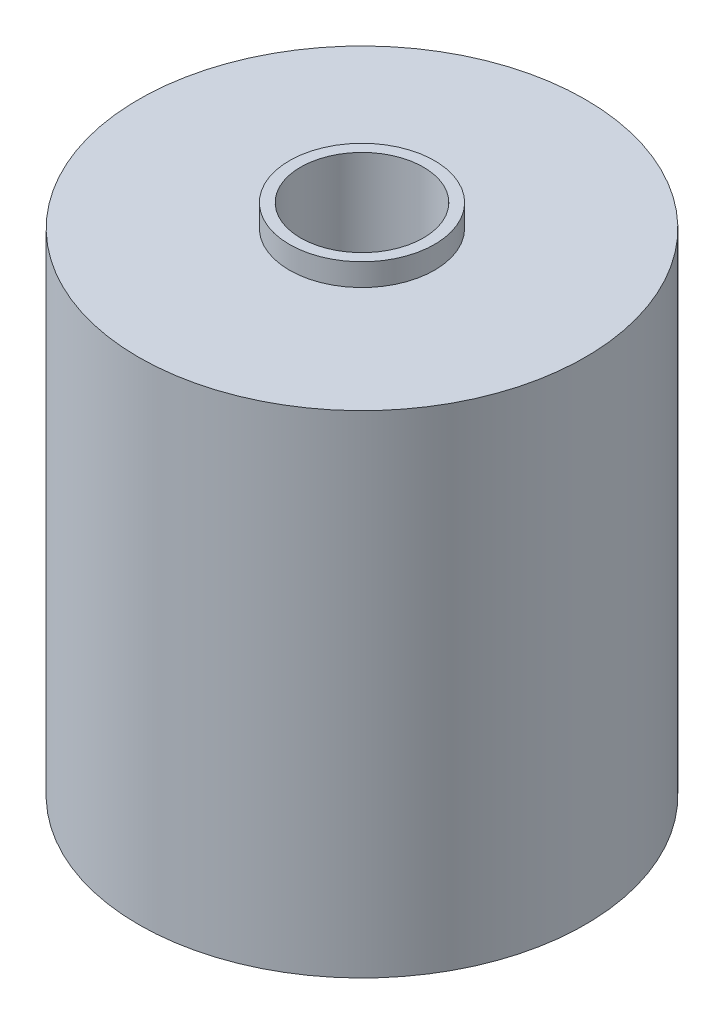
ISO-10303-21;
HEADER;
FILE_DESCRIPTION(('STEP AP214'),'2;1');
FILE_NAME('part.step','',(''),(''),'','','');
FILE_SCHEMA(('AUTOMOTIVE_DESIGN { 1 0 10303 214 1 1 1 1 }'));
ENDSEC;
DATA;
#1=APPLICATION_CONTEXT('core data for automotive mechanical design processes');
#2=APPLICATION_PROTOCOL_DEFINITION('international standard','automotive_design',2000,#1);
#3=PRODUCT_CONTEXT('',#1,'mechanical');
#4=PRODUCT('Part','Part','',(#3));
#5=PRODUCT_RELATED_PRODUCT_CATEGORY('part','',(#4));
#6=PRODUCT_DEFINITION_FORMATION('','',#4);
#7=PRODUCT_DEFINITION_CONTEXT('part definition',#1,'design');
#8=PRODUCT_DEFINITION('design','',#6,#7);
#9=PRODUCT_DEFINITION_SHAPE('','',#8);
#10=(LENGTH_UNIT() NAMED_UNIT(*) SI_UNIT(.MILLI.,.METRE.));
#11=(NAMED_UNIT(*) PLANE_ANGLE_UNIT() SI_UNIT($,.RADIAN.));
#12=(NAMED_UNIT(*) SI_UNIT($,.STERADIAN.) SOLID_ANGLE_UNIT());
#13=UNCERTAINTY_MEASURE_WITH_UNIT(LENGTH_MEASURE(1.E-05),#10,'distance_accuracy_value','');
#14=(GEOMETRIC_REPRESENTATION_CONTEXT(3) GLOBAL_UNCERTAINTY_ASSIGNED_CONTEXT((#13)) GLOBAL_UNIT_ASSIGNED_CONTEXT((#10,
#11,#12)) REPRESENTATION_CONTEXT('',''));
#15=CARTESIAN_POINT('',(0.,0.,0.));
#16=DIRECTION('',(0.,0.,1.));
#17=DIRECTION('',(1.,0.,0.));
#18=AXIS2_PLACEMENT_3D('',#15,#16,#17);
#19=CARTESIAN_POINT('',(0.,11.,0.));
#20=DIRECTION('',(0.,-1.,0.));
#21=DIRECTION('',(0.,0.,-1.));
#22=AXIS2_PLACEMENT_3D('',#19,#20,#21);
#23=CYLINDRICAL_SURFACE('',#22,10.);
#24=CARTESIAN_POINT('',(0.,11.,0.));
#25=DIRECTION('',(0.,1.,0.));
#26=DIRECTION('',(0.,0.,1.));
#27=AXIS2_PLACEMENT_3D('',#24,#25,#26);
#28=CIRCLE('',#27,10.);
#29=CARTESIAN_POINT('',(0.,11.,10.));
#30=VERTEX_POINT('',#29);
#31=EDGE_CURVE('E10',#30,#30,#28,.T.);
#32=ORIENTED_EDGE('',*,*,#31,.F.);
#33=EDGE_LOOP('',(#32));
#34=FACE_BOUND('',#33,.T.);
#35=CARTESIAN_POINT('',(0.,-11.,0.));
#36=DIRECTION('',(0.,1.,0.));
#37=DIRECTION('',(0.,0.,1.));
#38=AXIS2_PLACEMENT_3D('',#35,#36,#37);
#39=CIRCLE('',#38,10.);
#40=CARTESIAN_POINT('',(0.,-11.,10.));
#41=VERTEX_POINT('',#40);
#42=EDGE_CURVE('E36',#41,#41,#39,.T.);
#43=ORIENTED_EDGE('',*,*,#42,.T.);
#44=EDGE_LOOP('',(#43));
#45=FACE_BOUND('',#44,.T.);
#46=ADVANCED_FACE('F33',(#34,#45),#23,.T.);
#47=CARTESIAN_POINT('',(0.,11.,0.));
#48=DIRECTION('',(0.,1.,0.));
#49=DIRECTION('',(0.,0.,1.));
#50=AXIS2_PLACEMENT_3D('',#47,#48,#49);
#51=PLANE('',#50);
#52=CARTESIAN_POINT('',(0.,11.,0.));
#53=DIRECTION('',(0.,1.,0.));
#54=DIRECTION('',(0.,0.,1.));
#55=AXIS2_PLACEMENT_3D('',#52,#53,#54);
#56=CIRCLE('',#55,3.25);
#57=CARTESIAN_POINT('',(0.,11.,3.25));
#58=VERTEX_POINT('',#57);
#59=EDGE_CURVE('E40',#58,#58,#56,.T.);
#60=ORIENTED_EDGE('',*,*,#59,.F.);
#61=EDGE_LOOP('',(#60));
#62=FACE_BOUND('',#61,.T.);
#63=ORIENTED_EDGE('',*,*,#31,.T.);
#64=EDGE_LOOP('',(#63));
#65=FACE_BOUND('',#64,.T.);
#66=ADVANCED_FACE('F86',(#62,#65),#51,.T.);
#67=CARTESIAN_POINT('',(0.,-11.,0.));
#68=DIRECTION('',(0.,1.,0.));
#69=DIRECTION('',(0.,0.,1.));
#70=AXIS2_PLACEMENT_3D('',#67,#68,#69);
#71=PLANE('',#70);
#72=CARTESIAN_POINT('',(0.,-11.,0.));
#73=DIRECTION('',(0.,1.,0.));
#74=DIRECTION('',(0.,0.,1.));
#75=AXIS2_PLACEMENT_3D('',#72,#73,#74);
#76=CIRCLE('',#75,3.25);
#77=CARTESIAN_POINT('',(0.,-11.,3.25));
#78=VERTEX_POINT('',#77);
#79=EDGE_CURVE('E46',#78,#78,#76,.F.);
#80=ORIENTED_EDGE('',*,*,#79,.F.);
#81=EDGE_LOOP('',(#80));
#82=FACE_BOUND('',#81,.T.);
#83=ORIENTED_EDGE('',*,*,#42,.F.);
#84=EDGE_LOOP('',(#83));
#85=FACE_BOUND('',#84,.T.);
#86=ADVANCED_FACE('F83',(#82,#85),#71,.F.);
#87=CARTESIAN_POINT('',(0.,12.,0.));
#88=DIRECTION('',(0.,-1.,0.));
#89=DIRECTION('',(0.,0.,-1.));
#90=AXIS2_PLACEMENT_3D('',#87,#88,#89);
#91=CYLINDRICAL_SURFACE('',#90,3.25);
#92=CARTESIAN_POINT('',(0.,-12.,0.));
#93=DIRECTION('',(0.,1.,0.));
#94=DIRECTION('',(0.,0.,1.));
#95=AXIS2_PLACEMENT_3D('',#92,#93,#94);
#96=CIRCLE('',#95,3.25);
#97=CARTESIAN_POINT('',(0.,-12.,3.25));
#98=VERTEX_POINT('',#97);
#99=EDGE_CURVE('E50',#98,#98,#96,.T.);
#100=ORIENTED_EDGE('',*,*,#99,.T.);
#101=EDGE_LOOP('',(#100));
#102=FACE_BOUND('',#101,.T.);
#103=ORIENTED_EDGE('',*,*,#79,.T.);
#104=EDGE_LOOP('',(#103));
#105=FACE_BOUND('',#104,.T.);
#106=ADVANCED_FACE('F76',(#102,#105),#91,.T.);
#107=CARTESIAN_POINT('',(0.,12.,0.));
#108=DIRECTION('',(0.,-1.,0.));
#109=DIRECTION('',(0.,0.,-1.));
#110=AXIS2_PLACEMENT_3D('',#107,#108,#109);
#111=CYLINDRICAL_SURFACE('',#110,2.75);
#112=CARTESIAN_POINT('',(0.,12.,0.));
#113=DIRECTION('',(0.,1.,0.));
#114=DIRECTION('',(0.,0.,1.));
#115=AXIS2_PLACEMENT_3D('',#112,#113,#114);
#116=CIRCLE('',#115,2.75);
#117=CARTESIAN_POINT('',(0.,12.,2.75));
#118=VERTEX_POINT('',#117);
#119=EDGE_CURVE('E53',#118,#118,#116,.T.);
#120=ORIENTED_EDGE('',*,*,#119,.T.);
#121=EDGE_LOOP('',(#120));
#122=FACE_BOUND('',#121,.T.);
#123=CARTESIAN_POINT('',(0.,-12.,0.));
#124=DIRECTION('',(0.,1.,0.));
#125=DIRECTION('',(0.,0.,1.));
#126=AXIS2_PLACEMENT_3D('',#123,#124,#125);
#127=CIRCLE('',#126,2.75);
#128=CARTESIAN_POINT('',(0.,-12.,2.75));
#129=VERTEX_POINT('',#128);
#130=EDGE_CURVE('E54',#129,#129,#127,.T.);
#131=ORIENTED_EDGE('',*,*,#130,.F.);
#132=EDGE_LOOP('',(#131));
#133=FACE_BOUND('',#132,.T.);
#134=ADVANCED_FACE('F62',(#122,#133),#111,.F.);
#135=ORIENTED_EDGE('',*,*,#59,.T.);
#136=EDGE_LOOP('',(#135));
#137=FACE_BOUND('',#136,.T.);
#138=CARTESIAN_POINT('',(0.,12.,0.));
#139=DIRECTION('',(0.,1.,0.));
#140=DIRECTION('',(0.,0.,1.));
#141=AXIS2_PLACEMENT_3D('',#138,#139,#140);
#142=CIRCLE('',#141,3.25);
#143=CARTESIAN_POINT('',(0.,12.,3.25));
#144=VERTEX_POINT('',#143);
#145=EDGE_CURVE('E49',#144,#144,#142,.T.);
#146=ORIENTED_EDGE('',*,*,#145,.F.);
#147=EDGE_LOOP('',(#146));
#148=FACE_BOUND('',#147,.T.);
#149=ADVANCED_FACE('F69',(#137,#148),#91,.T.);
#150=CARTESIAN_POINT('',(0.,12.,0.));
#151=DIRECTION('',(0.,1.,0.));
#152=DIRECTION('',(0.,0.,1.));
#153=AXIS2_PLACEMENT_3D('',#150,#151,#152);
#154=PLANE('',#153);
#155=ORIENTED_EDGE('',*,*,#119,.F.);
#156=EDGE_LOOP('',(#155));
#157=FACE_BOUND('',#156,.T.);
#158=ORIENTED_EDGE('',*,*,#145,.T.);
#159=EDGE_LOOP('',(#158));
#160=FACE_BOUND('',#159,.T.);
#161=ADVANCED_FACE('F65',(#157,#160),#154,.T.);
#162=CARTESIAN_POINT('',(0.,-12.,0.));
#163=DIRECTION('',(0.,1.,0.));
#164=DIRECTION('',(0.,0.,1.));
#165=AXIS2_PLACEMENT_3D('',#162,#163,#164);
#166=PLANE('',#165);
#167=ORIENTED_EDGE('',*,*,#130,.T.);
#168=EDGE_LOOP('',(#167));
#169=FACE_BOUND('',#168,.T.);
#170=ORIENTED_EDGE('',*,*,#99,.F.);
#171=EDGE_LOOP('',(#170));
#172=FACE_BOUND('',#171,.T.);
#173=ADVANCED_FACE('F68',(#169,#172),#166,.F.);
#174=CLOSED_SHELL('',(#46,#66,#86,#106,#134,#149,#161,#173));
#175=MANIFOLD_SOLID_BREP('B2',#174);
#176=ADVANCED_BREP_SHAPE_REPRESENTATION('',(#18,#175),#14);
#177=SHAPE_DEFINITION_REPRESENTATION(#9,#176);
ENDSEC;
END-ISO-10303-21;
